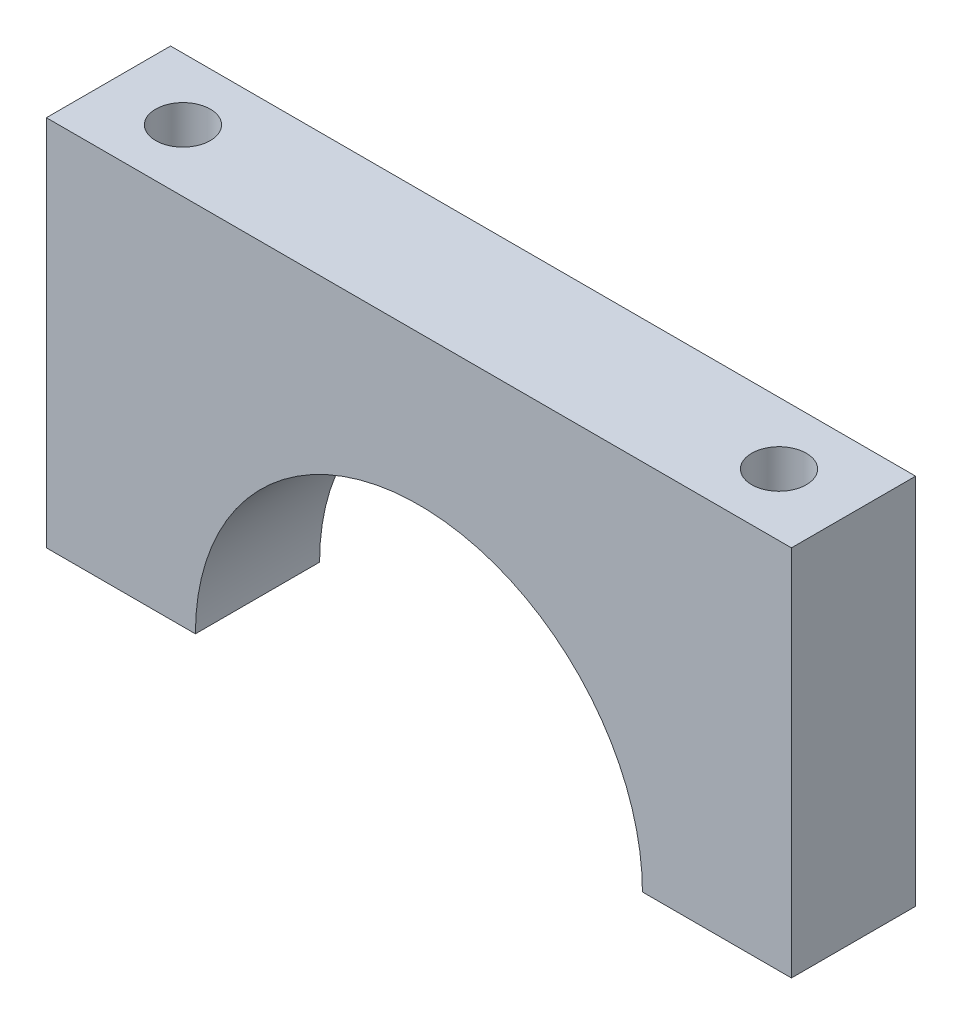
ISO-10303-21;
HEADER;
FILE_DESCRIPTION(('STEP AP214'),'2;1');
FILE_NAME('part.step','',(''),(''),'','','');
FILE_SCHEMA(('AUTOMOTIVE_DESIGN { 1 0 10303 214 1 1 1 1 }'));
ENDSEC;
DATA;
#1=APPLICATION_CONTEXT('core data for automotive mechanical design processes');
#2=APPLICATION_PROTOCOL_DEFINITION('international standard','automotive_design',2000,#1);
#3=PRODUCT_CONTEXT('',#1,'mechanical');
#4=PRODUCT('Part','Part','',(#3));
#5=PRODUCT_RELATED_PRODUCT_CATEGORY('part','',(#4));
#6=PRODUCT_DEFINITION_FORMATION('','',#4);
#7=PRODUCT_DEFINITION_CONTEXT('part definition',#1,'design');
#8=PRODUCT_DEFINITION('design','',#6,#7);
#9=PRODUCT_DEFINITION_SHAPE('','',#8);
#10=(LENGTH_UNIT() NAMED_UNIT(*) SI_UNIT(.MILLI.,.METRE.));
#11=(NAMED_UNIT(*) PLANE_ANGLE_UNIT() SI_UNIT($,.RADIAN.));
#12=(NAMED_UNIT(*) SI_UNIT($,.STERADIAN.) SOLID_ANGLE_UNIT());
#13=UNCERTAINTY_MEASURE_WITH_UNIT(LENGTH_MEASURE(1.E-05),#10,'distance_accuracy_value','');
#14=(GEOMETRIC_REPRESENTATION_CONTEXT(3) GLOBAL_UNCERTAINTY_ASSIGNED_CONTEXT((#13)) GLOBAL_UNIT_ASSIGNED_CONTEXT((#10,
#11,#12)) REPRESENTATION_CONTEXT('',''));
#15=CARTESIAN_POINT('',(0.,0.,0.));
#16=DIRECTION('',(0.,0.,1.));
#17=DIRECTION('',(1.,0.,0.));
#18=AXIS2_PLACEMENT_3D('',#15,#16,#17);
#19=CARTESIAN_POINT('',(-15.,15.,5.));
#20=DIRECTION('',(0.,-1.,0.));
#21=DIRECTION('',(1.,0.,0.));
#22=AXIS2_PLACEMENT_3D('',#19,#20,#21);
#23=PLANE('',#22);
#24=DIRECTION('',(-1.,0.,0.));
#25=VECTOR('',#24,1.);
#26=CARTESIAN_POINT('',(-15.,15.,0.));
#27=LINE('',#26,#25);
#28=CARTESIAN_POINT('',(15.,15.,0.));
#29=VERTEX_POINT('',#28);
#30=CARTESIAN_POINT('',(-15.,15.,0.));
#31=VERTEX_POINT('',#30);
#32=EDGE_CURVE('E157',#29,#31,#27,.T.);
#33=ORIENTED_EDGE('',*,*,#32,.T.);
#34=DIRECTION('',(0.,0.,-1.));
#35=VECTOR('',#34,1.);
#36=CARTESIAN_POINT('',(-15.,15.,5.));
#37=LINE('',#36,#35);
#38=CARTESIAN_POINT('',(-15.,15.,5.));
#39=VERTEX_POINT('',#38);
#40=EDGE_CURVE('E54',#39,#31,#37,.T.);
#41=ORIENTED_EDGE('',*,*,#40,.F.);
#42=DIRECTION('',(-1.,0.,0.));
#43=VECTOR('',#42,1.);
#44=CARTESIAN_POINT('',(-15.,15.,5.));
#45=LINE('',#44,#43);
#46=CARTESIAN_POINT('',(15.,15.,5.));
#47=VERTEX_POINT('',#46);
#48=EDGE_CURVE('E119',#47,#39,#45,.T.);
#49=ORIENTED_EDGE('',*,*,#48,.F.);
#50=DIRECTION('',(0.,0.,-1.));
#51=VECTOR('',#50,1.);
#52=CARTESIAN_POINT('',(15.,15.,5.));
#53=LINE('',#52,#51);
#54=EDGE_CURVE('E11',#47,#29,#53,.T.);
#55=ORIENTED_EDGE('',*,*,#54,.T.);
#56=EDGE_LOOP('',(#33,#41,#49,#55));
#57=FACE_BOUND('',#56,.T.);
#58=CARTESIAN_POINT('',(12.,15.000012,2.5));
#59=DIRECTION('',(0.,1.,0.));
#60=DIRECTION('',(-1.,0.,0.));
#61=AXIS2_PLACEMENT_3D('',#58,#59,#60);
#62=CIRCLE('',#61,1.1);
#63=CARTESIAN_POINT('',(10.9,15.000012,2.5));
#64=VERTEX_POINT('',#63);
#65=EDGE_CURVE('E189',#64,#64,#62,.T.);
#66=ORIENTED_EDGE('',*,*,#65,.F.);
#67=EDGE_LOOP('',(#66));
#68=FACE_BOUND('',#67,.T.);
#69=CARTESIAN_POINT('',(-12.,15.000012,2.49999999999932));
#70=DIRECTION('',(0.,1.,0.));
#71=DIRECTION('',(-1.,0.,0.));
#72=AXIS2_PLACEMENT_3D('',#69,#70,#71);
#73=CIRCLE('',#72,1.1);
#74=CARTESIAN_POINT('',(-13.1,15.000012,2.49999999999932));
#75=VERTEX_POINT('',#74);
#76=EDGE_CURVE('E255',#75,#75,#73,.T.);
#77=ORIENTED_EDGE('',*,*,#76,.F.);
#78=EDGE_LOOP('',(#77));
#79=FACE_BOUND('',#78,.T.);
#80=ADVANCED_FACE('F43',(#57,#68,#79),#23,.F.);
#81=CARTESIAN_POINT('',(15.,0.,5.));
#82=DIRECTION('',(-1.,0.,0.));
#83=DIRECTION('',(0.,-1.,0.));
#84=AXIS2_PLACEMENT_3D('',#81,#82,#83);
#85=PLANE('',#84);
#86=DIRECTION('',(0.,1.,0.));
#87=VECTOR('',#86,1.);
#88=CARTESIAN_POINT('',(15.,0.,0.));
#89=LINE('',#88,#87);
#90=CARTESIAN_POINT('',(15.,0.,0.));
#91=VERTEX_POINT('',#90);
#92=EDGE_CURVE('E154',#91,#29,#89,.T.);
#93=ORIENTED_EDGE('',*,*,#92,.T.);
#94=ORIENTED_EDGE('',*,*,#54,.F.);
#95=DIRECTION('',(0.,1.,0.));
#96=VECTOR('',#95,1.);
#97=CARTESIAN_POINT('',(15.,0.,5.));
#98=LINE('',#97,#96);
#99=CARTESIAN_POINT('',(15.,0.,5.));
#100=VERTEX_POINT('',#99);
#101=EDGE_CURVE('E171',#100,#47,#98,.T.);
#102=ORIENTED_EDGE('',*,*,#101,.F.);
#103=DIRECTION('',(0.,0.,-1.));
#104=VECTOR('',#103,1.);
#105=CARTESIAN_POINT('',(15.,0.,5.));
#106=LINE('',#105,#104);
#107=EDGE_CURVE('E151',#100,#91,#106,.T.);
#108=ORIENTED_EDGE('',*,*,#107,.T.);
#109=EDGE_LOOP('',(#93,#94,#102,#108));
#110=FACE_BOUND('',#109,.T.);
#111=ADVANCED_FACE('F44',(#110),#85,.F.);
#112=CARTESIAN_POINT('',(-15.,0.,5.));
#113=DIRECTION('',(1.,0.,0.));
#114=DIRECTION('',(0.,0.,-1.));
#115=AXIS2_PLACEMENT_3D('',#112,#113,#114);
#116=PLANE('',#115);
#117=DIRECTION('',(0.,-1.,0.));
#118=VECTOR('',#117,1.);
#119=CARTESIAN_POINT('',(-15.,0.,0.));
#120=LINE('',#119,#118);
#121=CARTESIAN_POINT('',(-15.,0.,0.));
#122=VERTEX_POINT('',#121);
#123=EDGE_CURVE('E162',#31,#122,#120,.T.);
#124=ORIENTED_EDGE('',*,*,#123,.T.);
#125=DIRECTION('',(0.,0.,-1.));
#126=VECTOR('',#125,1.);
#127=CARTESIAN_POINT('',(-15.,0.,5.));
#128=LINE('',#127,#126);
#129=CARTESIAN_POINT('',(-15.,0.,5.));
#130=VERTEX_POINT('',#129);
#131=EDGE_CURVE('E141',#130,#122,#128,.T.);
#132=ORIENTED_EDGE('',*,*,#131,.F.);
#133=DIRECTION('',(0.,-1.,0.));
#134=VECTOR('',#133,1.);
#135=CARTESIAN_POINT('',(-15.,0.,5.));
#136=LINE('',#135,#134);
#137=EDGE_CURVE('E131',#39,#130,#136,.T.);
#138=ORIENTED_EDGE('',*,*,#137,.F.);
#139=ORIENTED_EDGE('',*,*,#40,.T.);
#140=EDGE_LOOP('',(#124,#132,#138,#139));
#141=FACE_BOUND('',#140,.T.);
#142=ADVANCED_FACE('F196',(#141),#116,.F.);
#143=CARTESIAN_POINT('',(-15.,0.,5.));
#144=DIRECTION('',(0.,1.,0.));
#145=DIRECTION('',(-1.,0.,0.));
#146=AXIS2_PLACEMENT_3D('',#143,#144,#145);
#147=PLANE('',#146);
#148=CARTESIAN_POINT('',(-12.,0.,2.49999999999932));
#149=DIRECTION('',(0.,1.,0.));
#150=DIRECTION('',(-1.,0.,0.));
#151=AXIS2_PLACEMENT_3D('',#148,#149,#150);
#152=CIRCLE('',#151,1.1);
#153=CARTESIAN_POINT('',(-13.1,0.,2.49999999999932));
#154=VERTEX_POINT('',#153);
#155=EDGE_CURVE('E159',#154,#154,#152,.T.);
#156=ORIENTED_EDGE('',*,*,#155,.T.);
#157=EDGE_LOOP('',(#156));
#158=FACE_BOUND('',#157,.T.);
#159=DIRECTION('',(1.,0.,0.));
#160=VECTOR('',#159,1.);
#161=CARTESIAN_POINT('',(-15.,0.,0.));
#162=LINE('',#161,#160);
#163=CARTESIAN_POINT('',(-9.,0.,0.));
#164=VERTEX_POINT('',#163);
#165=EDGE_CURVE('E143',#122,#164,#162,.T.);
#166=ORIENTED_EDGE('',*,*,#165,.T.);
#167=DIRECTION('',(0.,0.,-1.));
#168=VECTOR('',#167,1.);
#169=CARTESIAN_POINT('',(-9.,0.,5.));
#170=LINE('',#169,#168);
#171=CARTESIAN_POINT('',(-9.,0.,5.));
#172=VERTEX_POINT('',#171);
#173=EDGE_CURVE('E136',#172,#164,#170,.T.);
#174=ORIENTED_EDGE('',*,*,#173,.F.);
#175=DIRECTION('',(1.,0.,0.));
#176=VECTOR('',#175,1.);
#177=CARTESIAN_POINT('',(-15.,0.,5.));
#178=LINE('',#177,#176);
#179=EDGE_CURVE('E127',#130,#172,#178,.T.);
#180=ORIENTED_EDGE('',*,*,#179,.F.);
#181=ORIENTED_EDGE('',*,*,#131,.T.);
#182=EDGE_LOOP('',(#166,#174,#180,#181));
#183=FACE_BOUND('',#182,.T.);
#184=ADVANCED_FACE('F139',(#158,#183),#147,.F.);
#185=CARTESIAN_POINT('',(0.,0.,5.));
#186=DIRECTION('',(0.,0.,-1.));
#187=DIRECTION('',(-1.,0.,0.));
#188=AXIS2_PLACEMENT_3D('',#185,#186,#187);
#189=CYLINDRICAL_SURFACE('',#188,9.);
#190=CARTESIAN_POINT('',(0.,0.,0.));
#191=DIRECTION('',(0.,0.,-1.));
#192=DIRECTION('',(1.,0.,0.));
#193=AXIS2_PLACEMENT_3D('',#190,#191,#192);
#194=CIRCLE('',#193,9.);
#195=CARTESIAN_POINT('',(9.,0.,0.));
#196=VERTEX_POINT('',#195);
#197=EDGE_CURVE('E98',#164,#196,#194,.T.);
#198=ORIENTED_EDGE('',*,*,#197,.T.);
#199=DIRECTION('',(0.,0.,-1.));
#200=VECTOR('',#199,1.);
#201=CARTESIAN_POINT('',(9.,0.,5.));
#202=LINE('',#201,#200);
#203=CARTESIAN_POINT('',(9.,0.,5.));
#204=VERTEX_POINT('',#203);
#205=EDGE_CURVE('E145',#204,#196,#202,.T.);
#206=ORIENTED_EDGE('',*,*,#205,.F.);
#207=CARTESIAN_POINT('',(0.,0.,5.));
#208=DIRECTION('',(0.,0.,-1.));
#209=DIRECTION('',(1.,0.,0.));
#210=AXIS2_PLACEMENT_3D('',#207,#208,#209);
#211=CIRCLE('',#210,9.);
#212=EDGE_CURVE('E128',#172,#204,#211,.T.);
#213=ORIENTED_EDGE('',*,*,#212,.F.);
#214=ORIENTED_EDGE('',*,*,#173,.T.);
#215=EDGE_LOOP('',(#198,#206,#213,#214));
#216=FACE_BOUND('',#215,.T.);
#217=ADVANCED_FACE('F148',(#216),#189,.F.);
#218=CARTESIAN_POINT('',(9.,0.,5.));
#219=DIRECTION('',(0.,1.,0.));
#220=DIRECTION('',(0.,0.,1.));
#221=AXIS2_PLACEMENT_3D('',#218,#219,#220);
#222=PLANE('',#221);
#223=CARTESIAN_POINT('',(12.,0.,2.5));
#224=DIRECTION('',(0.,1.,0.));
#225=DIRECTION('',(-1.,0.,0.));
#226=AXIS2_PLACEMENT_3D('',#223,#224,#225);
#227=CIRCLE('',#226,1.1);
#228=CARTESIAN_POINT('',(10.9,0.,2.5));
#229=VERTEX_POINT('',#228);
#230=EDGE_CURVE('E257',#229,#229,#227,.T.);
#231=ORIENTED_EDGE('',*,*,#230,.T.);
#232=EDGE_LOOP('',(#231));
#233=FACE_BOUND('',#232,.T.);
#234=DIRECTION('',(1.,0.,0.));
#235=VECTOR('',#234,1.);
#236=CARTESIAN_POINT('',(9.,0.,0.));
#237=LINE('',#236,#235);
#238=EDGE_CURVE('E106',#196,#91,#237,.T.);
#239=ORIENTED_EDGE('',*,*,#238,.T.);
#240=ORIENTED_EDGE('',*,*,#107,.F.);
#241=DIRECTION('',(1.,0.,0.));
#242=VECTOR('',#241,1.);
#243=CARTESIAN_POINT('',(9.,0.,5.));
#244=LINE('',#243,#242);
#245=EDGE_CURVE('E70',#204,#100,#244,.T.);
#246=ORIENTED_EDGE('',*,*,#245,.F.);
#247=ORIENTED_EDGE('',*,*,#205,.T.);
#248=EDGE_LOOP('',(#239,#240,#246,#247));
#249=FACE_BOUND('',#248,.T.);
#250=ADVANCED_FACE('F208',(#233,#249),#222,.F.);
#251=CARTESIAN_POINT('',(0.,0.,5.));
#252=DIRECTION('',(0.,0.,1.));
#253=DIRECTION('',(1.,0.,0.));
#254=AXIS2_PLACEMENT_3D('',#251,#252,#253);
#255=PLANE('',#254);
#256=ORIENTED_EDGE('',*,*,#101,.T.);
#257=ORIENTED_EDGE('',*,*,#48,.T.);
#258=ORIENTED_EDGE('',*,*,#137,.T.);
#259=ORIENTED_EDGE('',*,*,#179,.T.);
#260=ORIENTED_EDGE('',*,*,#212,.T.);
#261=ORIENTED_EDGE('',*,*,#245,.T.);
#262=EDGE_LOOP('',(#256,#257,#258,#259,#260,#261));
#263=FACE_BOUND('',#262,.T.);
#264=ADVANCED_FACE('F126',(#263),#255,.T.);
#265=CARTESIAN_POINT('',(0.,0.,0.));
#266=DIRECTION('',(0.,0.,1.));
#267=DIRECTION('',(1.,0.,0.));
#268=AXIS2_PLACEMENT_3D('',#265,#266,#267);
#269=PLANE('',#268);
#270=ORIENTED_EDGE('',*,*,#92,.F.);
#271=ORIENTED_EDGE('',*,*,#238,.F.);
#272=ORIENTED_EDGE('',*,*,#197,.F.);
#273=ORIENTED_EDGE('',*,*,#165,.F.);
#274=ORIENTED_EDGE('',*,*,#123,.F.);
#275=ORIENTED_EDGE('',*,*,#32,.F.);
#276=EDGE_LOOP('',(#270,#271,#272,#273,#274,#275));
#277=FACE_BOUND('',#276,.T.);
#278=ADVANCED_FACE('F215',(#277),#269,.F.);
#279=CARTESIAN_POINT('',(12.,0.,2.5));
#280=DIRECTION('',(0.,1.,0.));
#281=DIRECTION('',(-1.,0.,0.));
#282=AXIS2_PLACEMENT_3D('',#279,#280,#281);
#283=CYLINDRICAL_SURFACE('',#282,1.1);
#284=ORIENTED_EDGE('',*,*,#230,.F.);
#285=EDGE_LOOP('',(#284));
#286=FACE_BOUND('',#285,.T.);
#287=ORIENTED_EDGE('',*,*,#65,.T.);
#288=EDGE_LOOP('',(#287));
#289=FACE_BOUND('',#288,.T.);
#290=ADVANCED_FACE('F214',(#286,#289),#283,.F.);
#291=CARTESIAN_POINT('',(-12.,0.,2.49999999999932));
#292=DIRECTION('',(0.,1.,0.));
#293=DIRECTION('',(-1.,0.,0.));
#294=AXIS2_PLACEMENT_3D('',#291,#292,#293);
#295=CYLINDRICAL_SURFACE('',#294,1.1);
#296=ORIENTED_EDGE('',*,*,#155,.F.);
#297=EDGE_LOOP('',(#296));
#298=FACE_BOUND('',#297,.T.);
#299=ORIENTED_EDGE('',*,*,#76,.T.);
#300=EDGE_LOOP('',(#299));
#301=FACE_BOUND('',#300,.T.);
#302=ADVANCED_FACE('F225',(#298,#301),#295,.F.);
#303=CLOSED_SHELL('',(#80,#111,#142,#184,#217,#250,#264,#278,#290,#302));
#304=MANIFOLD_SOLID_BREP('B2',#303);
#305=ADVANCED_BREP_SHAPE_REPRESENTATION('',(#18,#304),#14);
#306=SHAPE_DEFINITION_REPRESENTATION(#9,#305);
ENDSEC;
END-ISO-10303-21;
